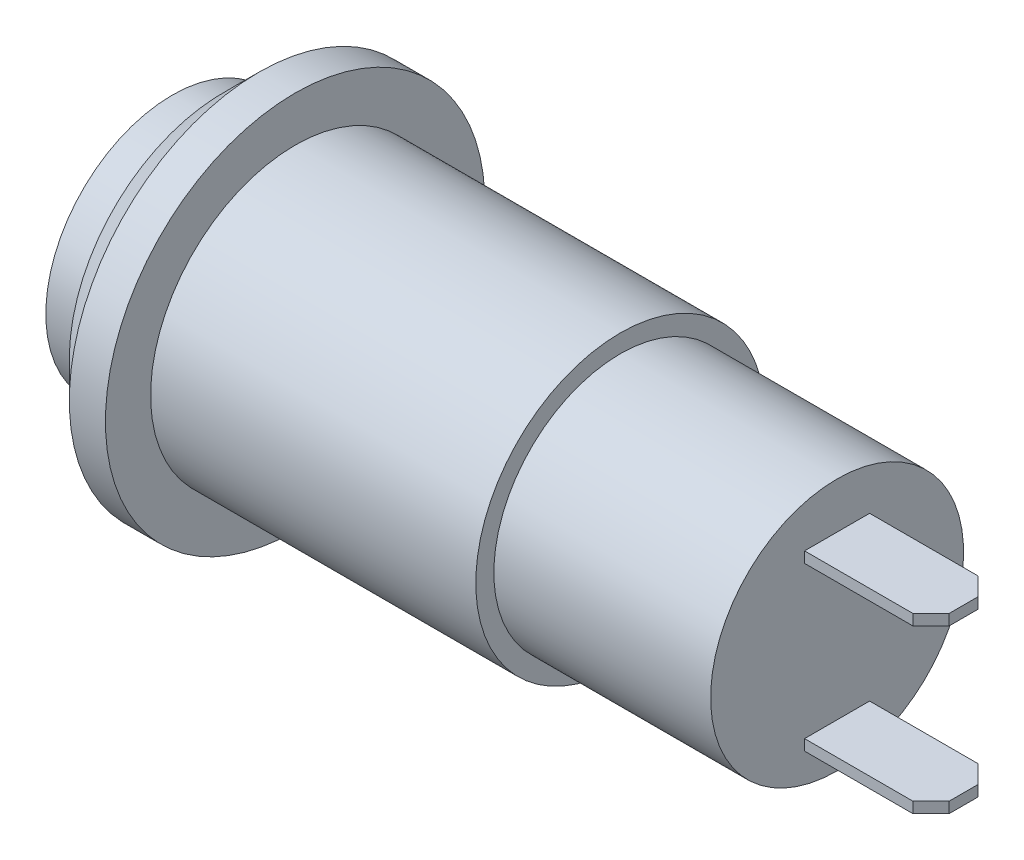
ISO-10303-21;
HEADER;
FILE_DESCRIPTION(('STEP AP214'),'2;1');
FILE_NAME('part.step','',(''),(''),'','','');
FILE_SCHEMA(('AUTOMOTIVE_DESIGN { 1 0 10303 214 1 1 1 1 }'));
ENDSEC;
DATA;
#1=APPLICATION_CONTEXT('core data for automotive mechanical design processes');
#2=APPLICATION_PROTOCOL_DEFINITION('international standard','automotive_design',2000,#1);
#3=PRODUCT_CONTEXT('',#1,'mechanical');
#4=PRODUCT('Part','Part','',(#3));
#5=PRODUCT_RELATED_PRODUCT_CATEGORY('part','',(#4));
#6=PRODUCT_DEFINITION_FORMATION('','',#4);
#7=PRODUCT_DEFINITION_CONTEXT('part definition',#1,'design');
#8=PRODUCT_DEFINITION('design','',#6,#7);
#9=PRODUCT_DEFINITION_SHAPE('','',#8);
#10=(LENGTH_UNIT() NAMED_UNIT(*) SI_UNIT(.MILLI.,.METRE.));
#11=(NAMED_UNIT(*) PLANE_ANGLE_UNIT() SI_UNIT($,.RADIAN.));
#12=(NAMED_UNIT(*) SI_UNIT($,.STERADIAN.) SOLID_ANGLE_UNIT());
#13=UNCERTAINTY_MEASURE_WITH_UNIT(LENGTH_MEASURE(1.E-05),#10,'distance_accuracy_value','');
#14=(GEOMETRIC_REPRESENTATION_CONTEXT(3) GLOBAL_UNCERTAINTY_ASSIGNED_CONTEXT((#13)) GLOBAL_UNIT_ASSIGNED_CONTEXT((#10,
#11,#12)) REPRESENTATION_CONTEXT('',''));
#15=CARTESIAN_POINT('',(0.,0.,0.));
#16=DIRECTION('',(0.,0.,1.));
#17=DIRECTION('',(1.,0.,0.));
#18=AXIS2_PLACEMENT_3D('',#15,#16,#17);
#19=CARTESIAN_POINT('',(18.4,3.5,0.));
#20=DIRECTION('',(1.,0.,0.));
#21=DIRECTION('',(0.,1.,0.));
#22=AXIS2_PLACEMENT_3D('',#19,#20,#21);
#23=PLANE('',#22);
#24=CARTESIAN_POINT('',(18.4,0.,0.));
#25=DIRECTION('',(1.,0.,0.));
#26=DIRECTION('',(0.,1.,0.));
#27=AXIS2_PLACEMENT_3D('',#24,#25,#26);
#28=CIRCLE('',#27,3.5);
#29=CARTESIAN_POINT('',(18.4,3.5,0.));
#30=VERTEX_POINT('',#29);
#31=EDGE_CURVE('E193',#30,#30,#28,.T.);
#32=ORIENTED_EDGE('',*,*,#31,.T.);
#33=EDGE_LOOP('',(#32));
#34=FACE_BOUND('',#33,.T.);
#35=DIRECTION('',(0.,0.,-1.));
#36=VECTOR('',#35,1.);
#37=CARTESIAN_POINT('',(18.4,1.925060305847,0.899999999999999));
#38=LINE('',#37,#36);
#39=CARTESIAN_POINT('',(18.4,1.925060305847,0.899999999999999));
#40=VERTEX_POINT('',#39);
#41=CARTESIAN_POINT('',(18.4,1.925060305847,-0.900000000000001));
#42=VERTEX_POINT('',#41);
#43=EDGE_CURVE('E162',#40,#42,#38,.T.);
#44=ORIENTED_EDGE('',*,*,#43,.F.);
#45=DIRECTION('',(0.,-1.,0.));
#46=VECTOR('',#45,1.);
#47=CARTESIAN_POINT('',(18.4,2.225060305847,0.899999999999999));
#48=LINE('',#47,#46);
#49=CARTESIAN_POINT('',(18.4,2.225060305847,0.899999999999999));
#50=VERTEX_POINT('',#49);
#51=EDGE_CURVE('E159',#50,#40,#48,.T.);
#52=ORIENTED_EDGE('',*,*,#51,.F.);
#53=DIRECTION('',(0.,0.,1.));
#54=VECTOR('',#53,1.);
#55=CARTESIAN_POINT('',(18.4,2.225060305847,0.899999999999999));
#56=LINE('',#55,#54);
#57=CARTESIAN_POINT('',(18.4,2.225060305847,-0.900000000000001));
#58=VERTEX_POINT('',#57);
#59=EDGE_CURVE('E175',#58,#50,#56,.T.);
#60=ORIENTED_EDGE('',*,*,#59,.F.);
#61=DIRECTION('',(0.,1.,0.));
#62=VECTOR('',#61,1.);
#63=CARTESIAN_POINT('',(18.4,2.225060305847,-0.900000000000001));
#64=LINE('',#63,#62);
#65=EDGE_CURVE('E181',#42,#58,#64,.T.);
#66=ORIENTED_EDGE('',*,*,#65,.F.);
#67=EDGE_LOOP('',(#44,#52,#60,#66));
#68=FACE_BOUND('',#67,.T.);
#69=DIRECTION('',(0.,0.,-1.));
#70=VECTOR('',#69,1.);
#71=CARTESIAN_POINT('',(18.4,-2.574939694153,0.9));
#72=LINE('',#71,#70);
#73=CARTESIAN_POINT('',(18.4,-2.574939694153,0.9));
#74=VERTEX_POINT('',#73);
#75=CARTESIAN_POINT('',(18.4,-2.574939694153,-0.9));
#76=VERTEX_POINT('',#75);
#77=EDGE_CURVE('E158',#74,#76,#72,.T.);
#78=ORIENTED_EDGE('',*,*,#77,.F.);
#79=DIRECTION('',(0.,-1.,0.));
#80=VECTOR('',#79,1.);
#81=CARTESIAN_POINT('',(18.4,-2.274939694153,0.9));
#82=LINE('',#81,#80);
#83=CARTESIAN_POINT('',(18.4,-2.274939694153,0.9));
#84=VERTEX_POINT('',#83);
#85=EDGE_CURVE('E137',#84,#74,#82,.T.);
#86=ORIENTED_EDGE('',*,*,#85,.F.);
#87=DIRECTION('',(0.,0.,1.));
#88=VECTOR('',#87,1.);
#89=CARTESIAN_POINT('',(18.4,-2.274939694153,0.9));
#90=LINE('',#89,#88);
#91=CARTESIAN_POINT('',(18.4,-2.274939694153,-0.9));
#92=VERTEX_POINT('',#91);
#93=EDGE_CURVE('E147',#92,#84,#90,.T.);
#94=ORIENTED_EDGE('',*,*,#93,.F.);
#95=DIRECTION('',(0.,1.,0.));
#96=VECTOR('',#95,1.);
#97=CARTESIAN_POINT('',(18.4,-2.274939694153,-0.9));
#98=LINE('',#97,#96);
#99=EDGE_CURVE('E154',#76,#92,#98,.T.);
#100=ORIENTED_EDGE('',*,*,#99,.F.);
#101=EDGE_LOOP('',(#78,#86,#94,#100));
#102=FACE_BOUND('',#101,.T.);
#103=ADVANCED_FACE('F42',(#34,#68,#102),#23,.T.);
#104=CARTESIAN_POINT('',(0.,0.,0.));
#105=DIRECTION('',(-1.,0.,0.));
#106=DIRECTION('',(0.,-1.,0.));
#107=AXIS2_PLACEMENT_3D('',#104,#105,#106);
#108=PLANE('',#107);
#109=CARTESIAN_POINT('',(0.,0.,0.));
#110=DIRECTION('',(1.,0.,0.));
#111=DIRECTION('',(0.,1.,0.));
#112=AXIS2_PLACEMENT_3D('',#109,#110,#111);
#113=CIRCLE('',#112,3.5);
#114=CARTESIAN_POINT('',(0.,3.5,0.));
#115=VERTEX_POINT('',#114);
#116=EDGE_CURVE('E211',#115,#115,#113,.T.);
#117=ORIENTED_EDGE('',*,*,#116,.F.);
#118=EDGE_LOOP('',(#117));
#119=FACE_BOUND('',#118,.T.);
#120=ADVANCED_FACE('F284',(#119),#108,.T.);
#121=CARTESIAN_POINT('',(18.4,0.,0.));
#122=DIRECTION('',(1.,0.,0.));
#123=DIRECTION('',(0.,1.,0.));
#124=AXIS2_PLACEMENT_3D('',#121,#122,#123);
#125=CYLINDRICAL_SURFACE('',#124,3.5);
#126=ORIENTED_EDGE('',*,*,#116,.T.);
#127=EDGE_LOOP('',(#126));
#128=FACE_BOUND('',#127,.T.);
#129=CARTESIAN_POINT('',(1.4,0.,0.));
#130=DIRECTION('',(1.,0.,0.));
#131=DIRECTION('',(0.,1.,0.));
#132=AXIS2_PLACEMENT_3D('',#129,#130,#131);
#133=CIRCLE('',#132,3.5);
#134=CARTESIAN_POINT('',(1.4,3.5,0.));
#135=VERTEX_POINT('',#134);
#136=EDGE_CURVE('E208',#135,#135,#133,.T.);
#137=ORIENTED_EDGE('',*,*,#136,.F.);
#138=EDGE_LOOP('',(#137));
#139=FACE_BOUND('',#138,.T.);
#140=ADVANCED_FACE('F289',(#128,#139),#125,.T.);
#141=CARTESIAN_POINT('',(1.4,3.5,0.));
#142=DIRECTION('',(-1.,0.,0.));
#143=DIRECTION('',(0.,-1.,0.));
#144=AXIS2_PLACEMENT_3D('',#141,#142,#143);
#145=PLANE('',#144);
#146=CARTESIAN_POINT('',(1.4,0.,0.));
#147=DIRECTION('',(-1.,0.,0.));
#148=DIRECTION('',(0.,-1.,0.));
#149=AXIS2_PLACEMENT_3D('',#146,#147,#148);
#150=CIRCLE('',#149,4.24999999999999);
#151=CARTESIAN_POINT('',(1.4,-4.24999999999999,0.));
#152=VERTEX_POINT('',#151);
#153=EDGE_CURVE('E217',#152,#152,#150,.T.);
#154=ORIENTED_EDGE('',*,*,#153,.T.);
#155=EDGE_LOOP('',(#154));
#156=FACE_BOUND('',#155,.T.);
#157=ORIENTED_EDGE('',*,*,#136,.T.);
#158=EDGE_LOOP('',(#157));
#159=FACE_BOUND('',#158,.T.);
#160=ADVANCED_FACE('F311',(#156,#159),#145,.T.);
#161=CARTESIAN_POINT('',(18.4,0.,0.));
#162=DIRECTION('',(1.,0.,0.));
#163=DIRECTION('',(0.,1.,0.));
#164=AXIS2_PLACEMENT_3D('',#161,#162,#163);
#165=CYLINDRICAL_SURFACE('',#164,5.25);
#166=CARTESIAN_POINT('',(2.4,0.,0.));
#167=DIRECTION('',(-1.,0.,0.));
#168=DIRECTION('',(0.,-1.,0.));
#169=AXIS2_PLACEMENT_3D('',#166,#167,#168);
#170=CIRCLE('',#169,5.25);
#171=CARTESIAN_POINT('',(2.4,-5.25,0.));
#172=VERTEX_POINT('',#171);
#173=EDGE_CURVE('E214',#172,#172,#170,.F.);
#174=ORIENTED_EDGE('',*,*,#173,.T.);
#175=EDGE_LOOP('',(#174));
#176=FACE_BOUND('',#175,.T.);
#177=CARTESIAN_POINT('',(3.4,0.,0.));
#178=DIRECTION('',(1.,0.,0.));
#179=DIRECTION('',(0.,1.,0.));
#180=AXIS2_PLACEMENT_3D('',#177,#178,#179);
#181=CIRCLE('',#180,5.25);
#182=CARTESIAN_POINT('',(3.4,5.25,0.));
#183=VERTEX_POINT('',#182);
#184=EDGE_CURVE('E205',#183,#183,#181,.T.);
#185=ORIENTED_EDGE('',*,*,#184,.F.);
#186=EDGE_LOOP('',(#185));
#187=FACE_BOUND('',#186,.T.);
#188=ADVANCED_FACE('F307',(#176,#187),#165,.T.);
#189=CARTESIAN_POINT('',(3.4,5.25,0.));
#190=DIRECTION('',(1.,0.,0.));
#191=DIRECTION('',(0.,1.,0.));
#192=AXIS2_PLACEMENT_3D('',#189,#190,#191);
#193=PLANE('',#192);
#194=ORIENTED_EDGE('',*,*,#184,.T.);
#195=EDGE_LOOP('',(#194));
#196=FACE_BOUND('',#195,.T.);
#197=CARTESIAN_POINT('',(3.4,0.,0.));
#198=DIRECTION('',(1.,0.,0.));
#199=DIRECTION('',(0.,1.,0.));
#200=AXIS2_PLACEMENT_3D('',#197,#198,#199);
#201=CIRCLE('',#200,4.);
#202=CARTESIAN_POINT('',(3.4,4.,0.));
#203=VERTEX_POINT('',#202);
#204=EDGE_CURVE('E202',#203,#203,#201,.T.);
#205=ORIENTED_EDGE('',*,*,#204,.F.);
#206=EDGE_LOOP('',(#205));
#207=FACE_BOUND('',#206,.T.);
#208=ADVANCED_FACE('F303',(#196,#207),#193,.T.);
#209=CARTESIAN_POINT('',(18.4,0.,0.));
#210=DIRECTION('',(1.,0.,0.));
#211=DIRECTION('',(0.,1.,0.));
#212=AXIS2_PLACEMENT_3D('',#209,#210,#211);
#213=CYLINDRICAL_SURFACE('',#212,4.);
#214=ORIENTED_EDGE('',*,*,#204,.T.);
#215=EDGE_LOOP('',(#214));
#216=FACE_BOUND('',#215,.T.);
#217=CARTESIAN_POINT('',(12.4,0.,0.));
#218=DIRECTION('',(1.,0.,0.));
#219=DIRECTION('',(0.,1.,0.));
#220=AXIS2_PLACEMENT_3D('',#217,#218,#219);
#221=CIRCLE('',#220,4.);
#222=CARTESIAN_POINT('',(12.4,4.,0.));
#223=VERTEX_POINT('',#222);
#224=EDGE_CURVE('E199',#223,#223,#221,.T.);
#225=ORIENTED_EDGE('',*,*,#224,.F.);
#226=EDGE_LOOP('',(#225));
#227=FACE_BOUND('',#226,.T.);
#228=ADVANCED_FACE('F299',(#216,#227),#213,.T.);
#229=CARTESIAN_POINT('',(12.4,4.,0.));
#230=DIRECTION('',(1.,0.,0.));
#231=DIRECTION('',(0.,1.,0.));
#232=AXIS2_PLACEMENT_3D('',#229,#230,#231);
#233=PLANE('',#232);
#234=ORIENTED_EDGE('',*,*,#224,.T.);
#235=EDGE_LOOP('',(#234));
#236=FACE_BOUND('',#235,.T.);
#237=CARTESIAN_POINT('',(12.4,0.,0.));
#238=DIRECTION('',(1.,0.,0.));
#239=DIRECTION('',(0.,1.,0.));
#240=AXIS2_PLACEMENT_3D('',#237,#238,#239);
#241=CIRCLE('',#240,3.5);
#242=CARTESIAN_POINT('',(12.4,3.5,0.));
#243=VERTEX_POINT('',#242);
#244=EDGE_CURVE('E196',#243,#243,#241,.T.);
#245=ORIENTED_EDGE('',*,*,#244,.F.);
#246=EDGE_LOOP('',(#245));
#247=FACE_BOUND('',#246,.T.);
#248=ADVANCED_FACE('F295',(#236,#247),#233,.T.);
#249=CARTESIAN_POINT('',(18.4,0.,0.));
#250=DIRECTION('',(1.,0.,0.));
#251=DIRECTION('',(0.,1.,0.));
#252=AXIS2_PLACEMENT_3D('',#249,#250,#251);
#253=CYLINDRICAL_SURFACE('',#252,3.5);
#254=ORIENTED_EDGE('',*,*,#244,.T.);
#255=EDGE_LOOP('',(#254));
#256=FACE_BOUND('',#255,.T.);
#257=ORIENTED_EDGE('',*,*,#31,.F.);
#258=EDGE_LOOP('',(#257));
#259=FACE_BOUND('',#258,.T.);
#260=ADVANCED_FACE('F279',(#256,#259),#253,.T.);
#261=CARTESIAN_POINT('',(2.4,0.,0.));
#262=DIRECTION('',(1.,0.,0.));
#263=DIRECTION('',(0.,1.,0.));
#264=AXIS2_PLACEMENT_3D('',#261,#262,#263);
#265=CONICAL_SURFACE('',#264,5.25,0.785398163397449);
#266=ORIENTED_EDGE('',*,*,#153,.F.);
#267=EDGE_LOOP('',(#266));
#268=FACE_BOUND('',#267,.T.);
#269=ORIENTED_EDGE('',*,*,#173,.F.);
#270=EDGE_LOOP('',(#269));
#271=FACE_BOUND('',#270,.T.);
#272=ADVANCED_FACE('F272',(#268,#271),#265,.T.);
#273=CARTESIAN_POINT('',(21.9,2.225060305847,0.899999999999999));
#274=DIRECTION('',(0.,0.,-1.));
#275=DIRECTION('',(-1.,0.,0.));
#276=AXIS2_PLACEMENT_3D('',#273,#274,#275);
#277=PLANE('',#276);
#278=DIRECTION('',(-1.,0.,0.));
#279=VECTOR('',#278,1.);
#280=CARTESIAN_POINT('',(21.9,1.925060305847,0.899999999999999));
#281=LINE('',#280,#279);
#282=CARTESIAN_POINT('',(21.4,1.925060305847,0.899999999999999));
#283=VERTEX_POINT('',#282);
#284=EDGE_CURVE('E191',#283,#40,#281,.T.);
#285=ORIENTED_EDGE('',*,*,#284,.F.);
#286=DIRECTION('',(0.,1.,0.));
#287=VECTOR('',#286,1.);
#288=CARTESIAN_POINT('',(21.4,2.225060305847,0.899999999999999));
#289=LINE('',#288,#287);
#290=CARTESIAN_POINT('',(21.4,2.225060305847,0.899999999999999));
#291=VERTEX_POINT('',#290);
#292=EDGE_CURVE('E11',#283,#291,#289,.T.);
#293=ORIENTED_EDGE('',*,*,#292,.T.);
#294=DIRECTION('',(-1.,0.,0.));
#295=VECTOR('',#294,1.);
#296=CARTESIAN_POINT('',(21.9,2.225060305847,0.899999999999999));
#297=LINE('',#296,#295);
#298=EDGE_CURVE('E177',#291,#50,#297,.T.);
#299=ORIENTED_EDGE('',*,*,#298,.T.);
#300=ORIENTED_EDGE('',*,*,#51,.T.);
#301=EDGE_LOOP('',(#285,#293,#299,#300));
#302=FACE_BOUND('',#301,.T.);
#303=ADVANCED_FACE('F270',(#302),#277,.F.);
#304=CARTESIAN_POINT('',(21.9,1.925060305847,0.899999999999999));
#305=DIRECTION('',(0.,1.,0.));
#306=DIRECTION('',(-1.,0.,0.));
#307=AXIS2_PLACEMENT_3D('',#304,#305,#306);
#308=PLANE('',#307);
#309=DIRECTION('',(-1.,0.,0.));
#310=VECTOR('',#309,1.);
#311=CARTESIAN_POINT('',(21.9,1.925060305847,-0.900000000000001));
#312=LINE('',#311,#310);
#313=CARTESIAN_POINT('',(21.4,1.925060305847,-0.900000000000001));
#314=VERTEX_POINT('',#313);
#315=EDGE_CURVE('E189',#314,#42,#312,.T.);
#316=ORIENTED_EDGE('',*,*,#315,.F.);
#317=DIRECTION('',(0.707106781186548,0.,0.707106781186548));
#318=VECTOR('',#317,1.);
#319=CARTESIAN_POINT('',(21.9,1.925060305847,-0.399999999999997));
#320=LINE('',#319,#318);
#321=CARTESIAN_POINT('',(21.9,1.925060305847,-0.399999999999997));
#322=VERTEX_POINT('',#321);
#323=EDGE_CURVE('E51',#314,#322,#320,.T.);
#324=ORIENTED_EDGE('',*,*,#323,.T.);
#325=DIRECTION('',(0.,0.,-1.));
#326=VECTOR('',#325,1.);
#327=CARTESIAN_POINT('',(21.9,1.925060305847,0.899999999999999));
#328=LINE('',#327,#326);
#329=CARTESIAN_POINT('',(21.9,1.925060305847,0.399999999999999));
#330=VERTEX_POINT('',#329);
#331=EDGE_CURVE('E171',#330,#322,#328,.T.);
#332=ORIENTED_EDGE('',*,*,#331,.F.);
#333=DIRECTION('',(-0.707106781186548,0.,0.707106781186548));
#334=VECTOR('',#333,1.);
#335=CARTESIAN_POINT('',(21.9,1.925060305847,0.399999999999999));
#336=LINE('',#335,#334);
#337=EDGE_CURVE('E58',#330,#283,#336,.T.);
#338=ORIENTED_EDGE('',*,*,#337,.T.);
#339=ORIENTED_EDGE('',*,*,#284,.T.);
#340=ORIENTED_EDGE('',*,*,#43,.T.);
#341=EDGE_LOOP('',(#316,#324,#332,#338,#339,#340));
#342=FACE_BOUND('',#341,.T.);
#343=ADVANCED_FACE('F249',(#342),#308,.F.);
#344=CARTESIAN_POINT('',(21.9,2.225060305847,-0.900000000000001));
#345=DIRECTION('',(0.,0.,1.));
#346=DIRECTION('',(1.,0.,0.));
#347=AXIS2_PLACEMENT_3D('',#344,#345,#346);
#348=PLANE('',#347);
#349=DIRECTION('',(-1.,0.,0.));
#350=VECTOR('',#349,1.);
#351=CARTESIAN_POINT('',(21.9,2.225060305847,-0.900000000000001));
#352=LINE('',#351,#350);
#353=CARTESIAN_POINT('',(21.4,2.225060305847,-0.900000000000001));
#354=VERTEX_POINT('',#353);
#355=EDGE_CURVE('E187',#354,#58,#352,.T.);
#356=ORIENTED_EDGE('',*,*,#355,.F.);
#357=DIRECTION('',(0.,-1.,0.));
#358=VECTOR('',#357,1.);
#359=CARTESIAN_POINT('',(21.4,1.925060305847,-0.900000000000001));
#360=LINE('',#359,#358);
#361=EDGE_CURVE('E66',#354,#314,#360,.T.);
#362=ORIENTED_EDGE('',*,*,#361,.T.);
#363=ORIENTED_EDGE('',*,*,#315,.T.);
#364=ORIENTED_EDGE('',*,*,#65,.T.);
#365=EDGE_LOOP('',(#356,#362,#363,#364));
#366=FACE_BOUND('',#365,.T.);
#367=ADVANCED_FACE('F259',(#366),#348,.F.);
#368=CARTESIAN_POINT('',(21.9,2.225060305847,0.899999999999999));
#369=DIRECTION('',(0.,-1.,0.));
#370=DIRECTION('',(0.,0.,-1.));
#371=AXIS2_PLACEMENT_3D('',#368,#369,#370);
#372=PLANE('',#371);
#373=DIRECTION('',(0.,0.,1.));
#374=VECTOR('',#373,1.);
#375=CARTESIAN_POINT('',(21.9,2.225060305847,0.899999999999999));
#376=LINE('',#375,#374);
#377=CARTESIAN_POINT('',(21.9,2.225060305847,-0.399999999999997));
#378=VERTEX_POINT('',#377);
#379=CARTESIAN_POINT('',(21.9,2.225060305847,0.399999999999999));
#380=VERTEX_POINT('',#379);
#381=EDGE_CURVE('E174',#378,#380,#376,.T.);
#382=ORIENTED_EDGE('',*,*,#381,.F.);
#383=DIRECTION('',(-0.707106781186548,0.,-0.707106781186548));
#384=VECTOR('',#383,1.);
#385=CARTESIAN_POINT('',(21.9,2.225060305847,-0.399999999999996));
#386=LINE('',#385,#384);
#387=EDGE_CURVE('E245',#378,#354,#386,.T.);
#388=ORIENTED_EDGE('',*,*,#387,.T.);
#389=ORIENTED_EDGE('',*,*,#355,.T.);
#390=ORIENTED_EDGE('',*,*,#59,.T.);
#391=ORIENTED_EDGE('',*,*,#298,.F.);
#392=DIRECTION('',(0.707106781186548,0.,-0.707106781186548));
#393=VECTOR('',#392,1.);
#394=CARTESIAN_POINT('',(21.9,2.225060305847,0.399999999999999));
#395=LINE('',#394,#393);
#396=EDGE_CURVE('E243',#291,#380,#395,.T.);
#397=ORIENTED_EDGE('',*,*,#396,.T.);
#398=EDGE_LOOP('',(#382,#388,#389,#390,#391,#397));
#399=FACE_BOUND('',#398,.T.);
#400=ADVANCED_FACE('F258',(#399),#372,.F.);
#401=CARTESIAN_POINT('',(21.9,0.,0.));
#402=DIRECTION('',(1.,0.,0.));
#403=DIRECTION('',(0.,0.,-1.));
#404=AXIS2_PLACEMENT_3D('',#401,#402,#403);
#405=PLANE('',#404);
#406=ORIENTED_EDGE('',*,*,#331,.T.);
#407=DIRECTION('',(0.,1.,0.));
#408=VECTOR('',#407,1.);
#409=CARTESIAN_POINT('',(21.9,2.225060305847,-0.399999999999997));
#410=LINE('',#409,#408);
#411=EDGE_CURVE('E240',#322,#378,#410,.T.);
#412=ORIENTED_EDGE('',*,*,#411,.T.);
#413=ORIENTED_EDGE('',*,*,#381,.T.);
#414=DIRECTION('',(0.,-1.,0.));
#415=VECTOR('',#414,1.);
#416=CARTESIAN_POINT('',(21.9,1.925060305847,0.399999999999999));
#417=LINE('',#416,#415);
#418=EDGE_CURVE('E237',#380,#330,#417,.T.);
#419=ORIENTED_EDGE('',*,*,#418,.T.);
#420=EDGE_LOOP('',(#406,#412,#413,#419));
#421=FACE_BOUND('',#420,.T.);
#422=ADVANCED_FACE('F253',(#421),#405,.T.);
#423=CARTESIAN_POINT('',(21.9,-2.274939694153,0.9));
#424=DIRECTION('',(0.,0.,-1.));
#425=DIRECTION('',(-1.,0.,0.));
#426=AXIS2_PLACEMENT_3D('',#423,#424,#425);
#427=PLANE('',#426);
#428=DIRECTION('',(-1.,0.,0.));
#429=VECTOR('',#428,1.);
#430=CARTESIAN_POINT('',(21.9,-2.574939694153,0.9));
#431=LINE('',#430,#429);
#432=CARTESIAN_POINT('',(21.4,-2.574939694153,0.9));
#433=VERTEX_POINT('',#432);
#434=EDGE_CURVE('E556',#433,#74,#431,.T.);
#435=ORIENTED_EDGE('',*,*,#434,.F.);
#436=DIRECTION('',(0.,1.,0.));
#437=VECTOR('',#436,1.);
#438=CARTESIAN_POINT('',(21.4,-2.274939694153,0.9));
#439=LINE('',#438,#437);
#440=CARTESIAN_POINT('',(21.4,-2.274939694153,0.9));
#441=VERTEX_POINT('',#440);
#442=EDGE_CURVE('E140',#433,#441,#439,.T.);
#443=ORIENTED_EDGE('',*,*,#442,.T.);
#444=DIRECTION('',(-1.,0.,0.));
#445=VECTOR('',#444,1.);
#446=CARTESIAN_POINT('',(21.9,-2.274939694153,0.9));
#447=LINE('',#446,#445);
#448=EDGE_CURVE('E132',#441,#84,#447,.T.);
#449=ORIENTED_EDGE('',*,*,#448,.T.);
#450=ORIENTED_EDGE('',*,*,#85,.T.);
#451=EDGE_LOOP('',(#435,#443,#449,#450));
#452=FACE_BOUND('',#451,.T.);
#453=ADVANCED_FACE('F135',(#452),#427,.F.);
#454=CARTESIAN_POINT('',(21.9,-2.574939694153,0.9));
#455=DIRECTION('',(0.,1.,0.));
#456=DIRECTION('',(-1.,0.,0.));
#457=AXIS2_PLACEMENT_3D('',#454,#455,#456);
#458=PLANE('',#457);
#459=DIRECTION('',(-1.,0.,0.));
#460=VECTOR('',#459,1.);
#461=CARTESIAN_POINT('',(21.9,-2.574939694153,-0.9));
#462=LINE('',#461,#460);
#463=CARTESIAN_POINT('',(21.4,-2.574939694153,-0.9));
#464=VERTEX_POINT('',#463);
#465=EDGE_CURVE('E553',#464,#76,#462,.T.);
#466=ORIENTED_EDGE('',*,*,#465,.F.);
#467=DIRECTION('',(0.707106781186548,0.,0.707106781186548));
#468=VECTOR('',#467,1.);
#469=CARTESIAN_POINT('',(21.9,-2.574939694153,-0.399999999999999));
#470=LINE('',#469,#468);
#471=CARTESIAN_POINT('',(21.9,-2.574939694153,-0.399999999999999));
#472=VERTEX_POINT('',#471);
#473=EDGE_CURVE('E234',#464,#472,#470,.T.);
#474=ORIENTED_EDGE('',*,*,#473,.T.);
#475=DIRECTION('',(0.,0.,-1.));
#476=VECTOR('',#475,1.);
#477=CARTESIAN_POINT('',(21.9,-2.574939694153,0.9));
#478=LINE('',#477,#476);
#479=CARTESIAN_POINT('',(21.9,-2.574939694153,0.399999999999996));
#480=VERTEX_POINT('',#479);
#481=EDGE_CURVE('E155',#480,#472,#478,.T.);
#482=ORIENTED_EDGE('',*,*,#481,.F.);
#483=DIRECTION('',(-0.707106781186548,0.,0.707106781186548));
#484=VECTOR('',#483,1.);
#485=CARTESIAN_POINT('',(21.9,-2.574939694153,0.399999999999996));
#486=LINE('',#485,#484);
#487=EDGE_CURVE('E232',#480,#433,#486,.T.);
#488=ORIENTED_EDGE('',*,*,#487,.T.);
#489=ORIENTED_EDGE('',*,*,#434,.T.);
#490=ORIENTED_EDGE('',*,*,#77,.T.);
#491=EDGE_LOOP('',(#466,#474,#482,#488,#489,#490));
#492=FACE_BOUND('',#491,.T.);
#493=ADVANCED_FACE('F394',(#492),#458,.F.);
#494=CARTESIAN_POINT('',(21.9,-2.274939694153,-0.9));
#495=DIRECTION('',(0.,0.,1.));
#496=DIRECTION('',(1.,0.,0.));
#497=AXIS2_PLACEMENT_3D('',#494,#495,#496);
#498=PLANE('',#497);
#499=DIRECTION('',(-1.,0.,0.));
#500=VECTOR('',#499,1.);
#501=CARTESIAN_POINT('',(21.9,-2.274939694153,-0.9));
#502=LINE('',#501,#500);
#503=CARTESIAN_POINT('',(21.4,-2.274939694153,-0.9));
#504=VERTEX_POINT('',#503);
#505=EDGE_CURVE('E144',#504,#92,#502,.T.);
#506=ORIENTED_EDGE('',*,*,#505,.F.);
#507=DIRECTION('',(0.,-1.,0.));
#508=VECTOR('',#507,1.);
#509=CARTESIAN_POINT('',(21.4,-2.574939694153,-0.9));
#510=LINE('',#509,#508);
#511=EDGE_CURVE('E230',#504,#464,#510,.T.);
#512=ORIENTED_EDGE('',*,*,#511,.T.);
#513=ORIENTED_EDGE('',*,*,#465,.T.);
#514=ORIENTED_EDGE('',*,*,#99,.T.);
#515=EDGE_LOOP('',(#506,#512,#513,#514));
#516=FACE_BOUND('',#515,.T.);
#517=ADVANCED_FACE('F384',(#516),#498,.F.);
#518=CARTESIAN_POINT('',(21.9,-2.274939694153,0.9));
#519=DIRECTION('',(0.,-1.,0.));
#520=DIRECTION('',(1.,0.,0.));
#521=AXIS2_PLACEMENT_3D('',#518,#519,#520);
#522=PLANE('',#521);
#523=DIRECTION('',(0.,0.,1.));
#524=VECTOR('',#523,1.);
#525=CARTESIAN_POINT('',(21.9,-2.274939694153,0.9));
#526=LINE('',#525,#524);
#527=CARTESIAN_POINT('',(21.9,-2.274939694153,-0.399999999999999));
#528=VERTEX_POINT('',#527);
#529=CARTESIAN_POINT('',(21.9,-2.274939694153,0.399999999999996));
#530=VERTEX_POINT('',#529);
#531=EDGE_CURVE('E143',#528,#530,#526,.T.);
#532=ORIENTED_EDGE('',*,*,#531,.F.);
#533=DIRECTION('',(-0.707106781186548,0.,-0.707106781186548));
#534=VECTOR('',#533,1.);
#535=CARTESIAN_POINT('',(21.9,-2.274939694153,-0.399999999999999));
#536=LINE('',#535,#534);
#537=EDGE_CURVE('E228',#528,#504,#536,.T.);
#538=ORIENTED_EDGE('',*,*,#537,.T.);
#539=ORIENTED_EDGE('',*,*,#505,.T.);
#540=ORIENTED_EDGE('',*,*,#93,.T.);
#541=ORIENTED_EDGE('',*,*,#448,.F.);
#542=DIRECTION('',(0.707106781186548,0.,-0.707106781186548));
#543=VECTOR('',#542,1.);
#544=CARTESIAN_POINT('',(21.9,-2.274939694153,0.399999999999996));
#545=LINE('',#544,#543);
#546=EDGE_CURVE('E226',#441,#530,#545,.T.);
#547=ORIENTED_EDGE('',*,*,#546,.T.);
#548=EDGE_LOOP('',(#532,#538,#539,#540,#541,#547));
#549=FACE_BOUND('',#548,.T.);
#550=ADVANCED_FACE('F149',(#549),#522,.F.);
#551=CARTESIAN_POINT('',(21.9,0.,0.));
#552=DIRECTION('',(1.,0.,0.));
#553=DIRECTION('',(0.,0.,-1.));
#554=AXIS2_PLACEMENT_3D('',#551,#552,#553);
#555=PLANE('',#554);
#556=ORIENTED_EDGE('',*,*,#481,.T.);
#557=DIRECTION('',(0.,1.,0.));
#558=VECTOR('',#557,1.);
#559=CARTESIAN_POINT('',(21.9,-2.274939694153,-0.399999999999999));
#560=LINE('',#559,#558);
#561=EDGE_CURVE('E223',#472,#528,#560,.T.);
#562=ORIENTED_EDGE('',*,*,#561,.T.);
#563=ORIENTED_EDGE('',*,*,#531,.T.);
#564=DIRECTION('',(0.,-1.,0.));
#565=VECTOR('',#564,1.);
#566=CARTESIAN_POINT('',(21.9,-2.574939694153,0.399999999999996));
#567=LINE('',#566,#565);
#568=EDGE_CURVE('E220',#530,#480,#567,.T.);
#569=ORIENTED_EDGE('',*,*,#568,.T.);
#570=EDGE_LOOP('',(#556,#562,#563,#569));
#571=FACE_BOUND('',#570,.T.);
#572=ADVANCED_FACE('F330',(#571),#555,.T.);
#573=CARTESIAN_POINT('',(21.9,0.,-0.399999999999999));
#574=DIRECTION('',(0.707106781186547,0.,-0.707106781186547));
#575=DIRECTION('',(0.,-1.,0.));
#576=AXIS2_PLACEMENT_3D('',#573,#574,#575);
#577=PLANE('',#576);
#578=ORIENTED_EDGE('',*,*,#473,.F.);
#579=ORIENTED_EDGE('',*,*,#511,.F.);
#580=ORIENTED_EDGE('',*,*,#537,.F.);
#581=ORIENTED_EDGE('',*,*,#561,.F.);
#582=EDGE_LOOP('',(#578,#579,#580,#581));
#583=FACE_BOUND('',#582,.T.);
#584=ADVANCED_FACE('F323',(#583),#577,.T.);
#585=CARTESIAN_POINT('',(21.9,0.,0.399999999999996));
#586=DIRECTION('',(0.707106781186547,0.,0.707106781186547));
#587=DIRECTION('',(0.,1.,0.));
#588=AXIS2_PLACEMENT_3D('',#585,#586,#587);
#589=PLANE('',#588);
#590=ORIENTED_EDGE('',*,*,#546,.F.);
#591=ORIENTED_EDGE('',*,*,#442,.F.);
#592=ORIENTED_EDGE('',*,*,#487,.F.);
#593=ORIENTED_EDGE('',*,*,#568,.F.);
#594=EDGE_LOOP('',(#590,#591,#592,#593));
#595=FACE_BOUND('',#594,.T.);
#596=ADVANCED_FACE('F329',(#595),#589,.T.);
#597=CARTESIAN_POINT('',(21.9,0.,-0.399999999999997));
#598=DIRECTION('',(0.707106781186547,0.,-0.707106781186547));
#599=DIRECTION('',(0.,-1.,0.));
#600=AXIS2_PLACEMENT_3D('',#597,#598,#599);
#601=PLANE('',#600);
#602=ORIENTED_EDGE('',*,*,#323,.F.);
#603=ORIENTED_EDGE('',*,*,#361,.F.);
#604=ORIENTED_EDGE('',*,*,#387,.F.);
#605=ORIENTED_EDGE('',*,*,#411,.F.);
#606=EDGE_LOOP('',(#602,#603,#604,#605));
#607=FACE_BOUND('',#606,.T.);
#608=ADVANCED_FACE('F256',(#607),#601,.T.);
#609=CARTESIAN_POINT('',(21.9,0.,0.399999999999999));
#610=DIRECTION('',(0.707106781186547,0.,0.707106781186547));
#611=DIRECTION('',(0.,1.,0.));
#612=AXIS2_PLACEMENT_3D('',#609,#610,#611);
#613=PLANE('',#612);
#614=ORIENTED_EDGE('',*,*,#396,.F.);
#615=ORIENTED_EDGE('',*,*,#292,.F.);
#616=ORIENTED_EDGE('',*,*,#337,.F.);
#617=ORIENTED_EDGE('',*,*,#418,.F.);
#618=EDGE_LOOP('',(#614,#615,#616,#617));
#619=FACE_BOUND('',#618,.T.);
#620=ADVANCED_FACE('F45',(#619),#613,.T.);
#621=CLOSED_SHELL('',(#103,#120,#140,#160,#188,#208,#228,#248,#260,#272,#303,#343,#367,#400,
#422,#453,#493,#517,#550,#572,#584,#596,#608,#620));
#622=MANIFOLD_SOLID_BREP('B2',#621);
#623=ADVANCED_BREP_SHAPE_REPRESENTATION('',(#18,#622),#14);
#624=SHAPE_DEFINITION_REPRESENTATION(#9,#623);
ENDSEC;
END-ISO-10303-21;
